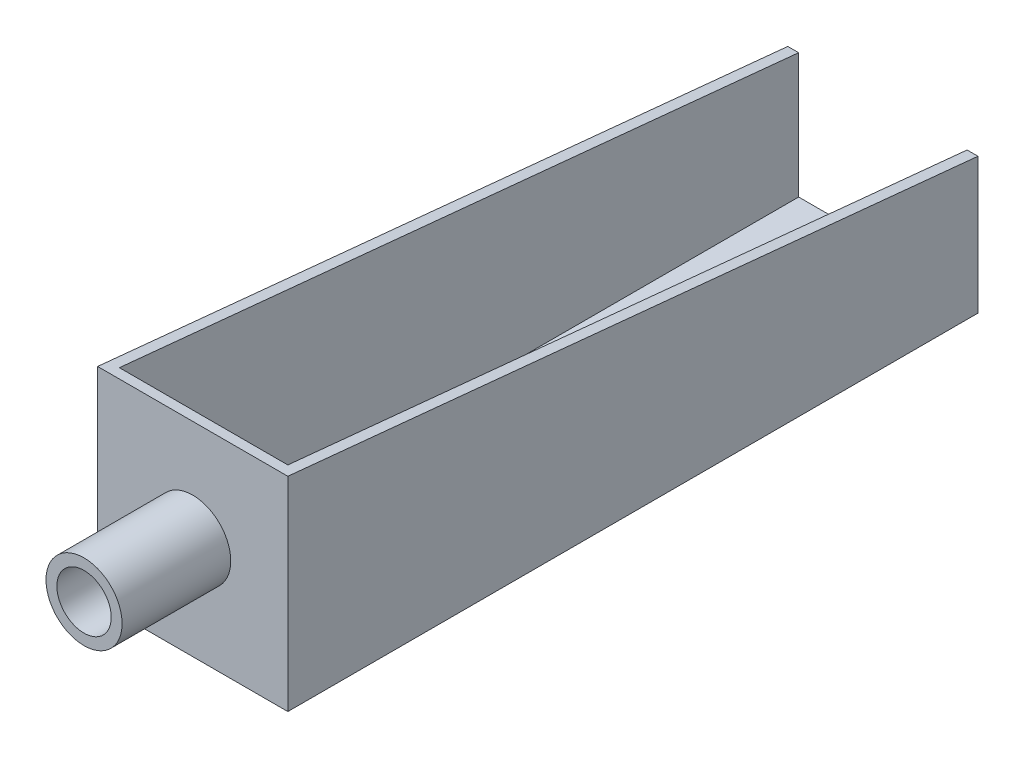
ISO-10303-21;
HEADER;
FILE_DESCRIPTION(('STEP AP214'),'2;1');
FILE_NAME('part.step','',(''),(''),'','','');
FILE_SCHEMA(('AUTOMOTIVE_DESIGN { 1 0 10303 214 1 1 1 1 }'));
ENDSEC;
DATA;
#1=APPLICATION_CONTEXT('core data for automotive mechanical design processes');
#2=APPLICATION_PROTOCOL_DEFINITION('international standard','automotive_design',2000,#1);
#3=PRODUCT_CONTEXT('',#1,'mechanical');
#4=PRODUCT('Part','Part','',(#3));
#5=PRODUCT_RELATED_PRODUCT_CATEGORY('part','',(#4));
#6=PRODUCT_DEFINITION_FORMATION('','',#4);
#7=PRODUCT_DEFINITION_CONTEXT('part definition',#1,'design');
#8=PRODUCT_DEFINITION('design','',#6,#7);
#9=PRODUCT_DEFINITION_SHAPE('','',#8);
#10=(LENGTH_UNIT() NAMED_UNIT(*) SI_UNIT(.MILLI.,.METRE.));
#11=(NAMED_UNIT(*) PLANE_ANGLE_UNIT() SI_UNIT($,.RADIAN.));
#12=(NAMED_UNIT(*) SI_UNIT($,.STERADIAN.) SOLID_ANGLE_UNIT());
#13=UNCERTAINTY_MEASURE_WITH_UNIT(LENGTH_MEASURE(1.E-05),#10,'distance_accuracy_value','');
#14=(GEOMETRIC_REPRESENTATION_CONTEXT(3) GLOBAL_UNCERTAINTY_ASSIGNED_CONTEXT((#13)) GLOBAL_UNIT_ASSIGNED_CONTEXT((#10,
#11,#12)) REPRESENTATION_CONTEXT('',''));
#15=CARTESIAN_POINT('',(0.,0.,0.));
#16=DIRECTION('',(0.,0.,1.));
#17=DIRECTION('',(1.,0.,0.));
#18=AXIS2_PLACEMENT_3D('',#15,#16,#17);
#19=CARTESIAN_POINT('',(35.,-37.5,4.));
#20=DIRECTION('',(-1.,0.,0.));
#21=DIRECTION('',(0.,0.,1.));
#22=AXIS2_PLACEMENT_3D('',#19,#20,#21);
#23=PLANE('',#22);
#24=DIRECTION('',(0.,-1.,0.));
#25=VECTOR('',#24,1.);
#26=CARTESIAN_POINT('',(35.,-37.5,-250.));
#27=LINE('',#26,#25);
#28=CARTESIAN_POINT('',(35.,12.5,-250.));
#29=VERTEX_POINT('',#28);
#30=CARTESIAN_POINT('',(35.,-37.5,-250.));
#31=VERTEX_POINT('',#30);
#32=EDGE_CURVE('E113',#29,#31,#27,.T.);
#33=ORIENTED_EDGE('',*,*,#32,.F.);
#34=DIRECTION('',(0.,0.0979518850000985,0.995191151601001));
#35=VECTOR('',#34,1.);
#36=CARTESIAN_POINT('',(35.,12.5,-250.));
#37=LINE('',#36,#35);
#38=CARTESIAN_POINT('',(35.,37.5,4.));
#39=VERTEX_POINT('',#38);
#40=EDGE_CURVE('E49',#29,#39,#37,.T.);
#41=ORIENTED_EDGE('',*,*,#40,.T.);
#42=DIRECTION('',(0.,1.,0.));
#43=VECTOR('',#42,1.);
#44=CARTESIAN_POINT('',(35.,-37.5,4.));
#45=LINE('',#44,#43);
#46=CARTESIAN_POINT('',(35.,-37.5,4.));
#47=VERTEX_POINT('',#46);
#48=EDGE_CURVE('E107',#47,#39,#45,.T.);
#49=ORIENTED_EDGE('',*,*,#48,.F.);
#50=DIRECTION('',(0.,0.,-1.));
#51=VECTOR('',#50,1.);
#52=CARTESIAN_POINT('',(35.,-37.5,4.));
#53=LINE('',#52,#51);
#54=EDGE_CURVE('E129',#47,#31,#53,.T.);
#55=ORIENTED_EDGE('',*,*,#54,.T.);
#56=EDGE_LOOP('',(#33,#41,#49,#55));
#57=FACE_BOUND('',#56,.T.);
#58=ADVANCED_FACE('F35',(#57),#23,.F.);
#59=CARTESIAN_POINT('',(-35.,-37.5,4.));
#60=DIRECTION('',(1.,0.,0.));
#61=DIRECTION('',(0.,0.,-1.));
#62=AXIS2_PLACEMENT_3D('',#59,#60,#61);
#63=PLANE('',#62);
#64=DIRECTION('',(0.,-1.,0.));
#65=VECTOR('',#64,1.);
#66=CARTESIAN_POINT('',(-35.,-37.5,4.));
#67=LINE('',#66,#65);
#68=CARTESIAN_POINT('',(-35.,37.5,4.));
#69=VERTEX_POINT('',#68);
#70=CARTESIAN_POINT('',(-35.,-37.5,4.));
#71=VERTEX_POINT('',#70);
#72=EDGE_CURVE('E106',#69,#71,#67,.T.);
#73=ORIENTED_EDGE('',*,*,#72,.F.);
#74=DIRECTION('',(0.,0.0979518850000985,0.995191151601001));
#75=VECTOR('',#74,1.);
#76=CARTESIAN_POINT('',(-35.,12.5,-250.));
#77=LINE('',#76,#75);
#78=CARTESIAN_POINT('',(-35.,12.5,-250.));
#79=VERTEX_POINT('',#78);
#80=EDGE_CURVE('E102',#79,#69,#77,.T.);
#81=ORIENTED_EDGE('',*,*,#80,.F.);
#82=DIRECTION('',(0.,1.,0.));
#83=VECTOR('',#82,1.);
#84=CARTESIAN_POINT('',(-35.,37.5,-250.));
#85=LINE('',#84,#83);
#86=CARTESIAN_POINT('',(-35.,-37.5,-250.));
#87=VERTEX_POINT('',#86);
#88=EDGE_CURVE('E141',#87,#79,#85,.T.);
#89=ORIENTED_EDGE('',*,*,#88,.F.);
#90=DIRECTION('',(0.,0.,-1.));
#91=VECTOR('',#90,1.);
#92=CARTESIAN_POINT('',(-35.,-37.5,4.));
#93=LINE('',#92,#91);
#94=EDGE_CURVE('E131',#71,#87,#93,.T.);
#95=ORIENTED_EDGE('',*,*,#94,.F.);
#96=EDGE_LOOP('',(#73,#81,#89,#95));
#97=FACE_BOUND('',#96,.T.);
#98=ADVANCED_FACE('F207',(#97),#63,.F.);
#99=CARTESIAN_POINT('',(-35.,-37.5,4.));
#100=DIRECTION('',(0.,1.,0.));
#101=DIRECTION('',(0.,0.,1.));
#102=AXIS2_PLACEMENT_3D('',#99,#100,#101);
#103=PLANE('',#102);
#104=ORIENTED_EDGE('',*,*,#94,.T.);
#105=DIRECTION('',(-1.,0.,0.));
#106=VECTOR('',#105,1.);
#107=CARTESIAN_POINT('',(-35.,-37.5,-250.));
#108=LINE('',#107,#106);
#109=EDGE_CURVE('E160',#31,#87,#108,.T.);
#110=ORIENTED_EDGE('',*,*,#109,.F.);
#111=ORIENTED_EDGE('',*,*,#54,.F.);
#112=DIRECTION('',(1.,0.,0.));
#113=VECTOR('',#112,1.);
#114=CARTESIAN_POINT('',(-35.,-37.5,4.));
#115=LINE('',#114,#113);
#116=EDGE_CURVE('E118',#71,#47,#115,.T.);
#117=ORIENTED_EDGE('',*,*,#116,.F.);
#118=EDGE_LOOP('',(#104,#110,#111,#117));
#119=FACE_BOUND('',#118,.T.);
#120=ADVANCED_FACE('F211',(#119),#103,.F.);
#121=CARTESIAN_POINT('',(0.,0.,4.));
#122=DIRECTION('',(0.,0.,-1.));
#123=DIRECTION('',(-1.,0.,0.));
#124=AXIS2_PLACEMENT_3D('',#121,#122,#123);
#125=PLANE('',#124);
#126=CARTESIAN_POINT('',(0.,0.,4.));
#127=DIRECTION('',(0.,0.,-1.));
#128=DIRECTION('',(-1.,0.,0.));
#129=AXIS2_PLACEMENT_3D('',#126,#127,#128);
#130=CIRCLE('',#129,14.);
#131=CARTESIAN_POINT('',(-14.,0.,4.));
#132=VERTEX_POINT('',#131);
#133=EDGE_CURVE('E11',#132,#132,#130,.F.);
#134=ORIENTED_EDGE('',*,*,#133,.F.);
#135=EDGE_LOOP('',(#134));
#136=FACE_BOUND('',#135,.T.);
#137=ORIENTED_EDGE('',*,*,#48,.T.);
#138=DIRECTION('',(-1.,0.,0.));
#139=VECTOR('',#138,1.);
#140=CARTESIAN_POINT('',(-35.,37.5,4.));
#141=LINE('',#140,#139);
#142=EDGE_CURVE('E99',#39,#69,#141,.T.);
#143=ORIENTED_EDGE('',*,*,#142,.T.);
#144=ORIENTED_EDGE('',*,*,#72,.T.);
#145=ORIENTED_EDGE('',*,*,#116,.T.);
#146=EDGE_LOOP('',(#137,#143,#144,#145));
#147=FACE_BOUND('',#146,.T.);
#148=ADVANCED_FACE('F116',(#136,#147),#125,.F.);
#149=CARTESIAN_POINT('',(0.,0.,0.));
#150=DIRECTION('',(0.,0.,-1.));
#151=DIRECTION('',(-1.,0.,0.));
#152=AXIS2_PLACEMENT_3D('',#149,#150,#151);
#153=PLANE('',#152);
#154=DIRECTION('',(-1.,0.,0.));
#155=VECTOR('',#154,1.);
#156=CARTESIAN_POINT('',(0.,37.1062992125984,0.));
#157=LINE('',#156,#155);
#158=CARTESIAN_POINT('',(31.,37.1062992125984,0.));
#159=VERTEX_POINT('',#158);
#160=CARTESIAN_POINT('',(-31.,37.1062992125984,0.));
#161=VERTEX_POINT('',#160);
#162=EDGE_CURVE('E174',#159,#161,#157,.T.);
#163=ORIENTED_EDGE('',*,*,#162,.F.);
#164=DIRECTION('',(0.,1.,0.));
#165=VECTOR('',#164,1.);
#166=CARTESIAN_POINT('',(31.,-33.5,0.));
#167=LINE('',#166,#165);
#168=CARTESIAN_POINT('',(31.,-33.5,0.));
#169=VERTEX_POINT('',#168);
#170=EDGE_CURVE('E57',#169,#159,#167,.T.);
#171=ORIENTED_EDGE('',*,*,#170,.F.);
#172=DIRECTION('',(1.,0.,0.));
#173=VECTOR('',#172,1.);
#174=CARTESIAN_POINT('',(-31.,-33.5,0.));
#175=LINE('',#174,#173);
#176=CARTESIAN_POINT('',(-31.,-33.5,0.));
#177=VERTEX_POINT('',#176);
#178=EDGE_CURVE('E152',#177,#169,#175,.T.);
#179=ORIENTED_EDGE('',*,*,#178,.F.);
#180=DIRECTION('',(0.,-1.,0.));
#181=VECTOR('',#180,1.);
#182=CARTESIAN_POINT('',(-31.,37.5,0.));
#183=LINE('',#182,#181);
#184=EDGE_CURVE('E163',#161,#177,#183,.T.);
#185=ORIENTED_EDGE('',*,*,#184,.F.);
#186=EDGE_LOOP('',(#163,#171,#179,#185));
#187=FACE_BOUND('',#186,.T.);
#188=ADVANCED_FACE('F173',(#187),#153,.T.);
#189=CARTESIAN_POINT('',(-31.,37.5,-250.));
#190=DIRECTION('',(-1.,0.,0.));
#191=DIRECTION('',(0.,0.,1.));
#192=AXIS2_PLACEMENT_3D('',#189,#190,#191);
#193=PLANE('',#192);
#194=DIRECTION('',(0.,-1.,0.));
#195=VECTOR('',#194,1.);
#196=CARTESIAN_POINT('',(-31.,37.5,-250.));
#197=LINE('',#196,#195);
#198=CARTESIAN_POINT('',(-31.,12.5,-250.));
#199=VERTEX_POINT('',#198);
#200=CARTESIAN_POINT('',(-31.,-33.5,-250.));
#201=VERTEX_POINT('',#200);
#202=EDGE_CURVE('E137',#199,#201,#197,.T.);
#203=ORIENTED_EDGE('',*,*,#202,.F.);
#204=DIRECTION('',(0.,0.0979518850000985,0.995191151601002));
#205=VECTOR('',#204,1.);
#206=CARTESIAN_POINT('',(-31.,12.7398642943768,-247.562978769132));
#207=LINE('',#206,#205);
#208=EDGE_CURVE('E145',#199,#161,#207,.T.);
#209=ORIENTED_EDGE('',*,*,#208,.T.);
#210=ORIENTED_EDGE('',*,*,#184,.T.);
#211=DIRECTION('',(0.,0.,1.));
#212=VECTOR('',#211,1.);
#213=CARTESIAN_POINT('',(-31.,-33.5,-250.));
#214=LINE('',#213,#212);
#215=EDGE_CURVE('E120',#201,#177,#214,.T.);
#216=ORIENTED_EDGE('',*,*,#215,.F.);
#217=EDGE_LOOP('',(#203,#209,#210,#216));
#218=FACE_BOUND('',#217,.T.);
#219=ADVANCED_FACE('F144',(#218),#193,.F.);
#220=CARTESIAN_POINT('',(-31.,-33.5,-250.));
#221=DIRECTION('',(0.,-1.,0.));
#222=DIRECTION('',(0.,0.,-1.));
#223=AXIS2_PLACEMENT_3D('',#220,#221,#222);
#224=PLANE('',#223);
#225=ORIENTED_EDGE('',*,*,#178,.T.);
#226=DIRECTION('',(0.,0.,1.));
#227=VECTOR('',#226,1.);
#228=CARTESIAN_POINT('',(31.,-33.5,-250.));
#229=LINE('',#228,#227);
#230=CARTESIAN_POINT('',(31.,-33.5,-250.));
#231=VERTEX_POINT('',#230);
#232=EDGE_CURVE('E123',#231,#169,#229,.T.);
#233=ORIENTED_EDGE('',*,*,#232,.F.);
#234=DIRECTION('',(1.,0.,0.));
#235=VECTOR('',#234,1.);
#236=CARTESIAN_POINT('',(-31.,-33.5,-250.));
#237=LINE('',#236,#235);
#238=EDGE_CURVE('E148',#201,#231,#237,.T.);
#239=ORIENTED_EDGE('',*,*,#238,.F.);
#240=ORIENTED_EDGE('',*,*,#215,.T.);
#241=EDGE_LOOP('',(#225,#233,#239,#240));
#242=FACE_BOUND('',#241,.T.);
#243=ADVANCED_FACE('F172',(#242),#224,.F.);
#244=CARTESIAN_POINT('',(31.,-33.5,-250.));
#245=DIRECTION('',(1.,0.,0.));
#246=DIRECTION('',(0.,0.,-1.));
#247=AXIS2_PLACEMENT_3D('',#244,#245,#246);
#248=PLANE('',#247);
#249=ORIENTED_EDGE('',*,*,#170,.T.);
#250=DIRECTION('',(0.,-0.0979518850000985,-0.995191151601002));
#251=VECTOR('',#250,1.);
#252=CARTESIAN_POINT('',(31.,12.0586496983467,-254.484119064798));
#253=LINE('',#252,#251);
#254=CARTESIAN_POINT('',(31.,12.5,-250.));
#255=VERTEX_POINT('',#254);
#256=EDGE_CURVE('E175',#159,#255,#253,.T.);
#257=ORIENTED_EDGE('',*,*,#256,.T.);
#258=DIRECTION('',(0.,1.,0.));
#259=VECTOR('',#258,1.);
#260=CARTESIAN_POINT('',(31.,-33.5,-250.));
#261=LINE('',#260,#259);
#262=EDGE_CURVE('E150',#231,#255,#261,.T.);
#263=ORIENTED_EDGE('',*,*,#262,.F.);
#264=ORIENTED_EDGE('',*,*,#232,.T.);
#265=EDGE_LOOP('',(#249,#257,#263,#264));
#266=FACE_BOUND('',#265,.T.);
#267=ADVANCED_FACE('F169',(#266),#248,.F.);
#268=CARTESIAN_POINT('',(0.,0.,-250.));
#269=DIRECTION('',(0.,0.,1.));
#270=DIRECTION('',(1.,0.,0.));
#271=AXIS2_PLACEMENT_3D('',#268,#269,#270);
#272=PLANE('',#271);
#273=ORIENTED_EDGE('',*,*,#88,.T.);
#274=DIRECTION('',(1.,0.,0.));
#275=VECTOR('',#274,1.);
#276=CARTESIAN_POINT('',(0.,12.5,-250.));
#277=LINE('',#276,#275);
#278=EDGE_CURVE('E42',#79,#199,#277,.T.);
#279=ORIENTED_EDGE('',*,*,#278,.T.);
#280=ORIENTED_EDGE('',*,*,#202,.T.);
#281=ORIENTED_EDGE('',*,*,#238,.T.);
#282=ORIENTED_EDGE('',*,*,#262,.T.);
#283=DIRECTION('',(-1.,0.,0.));
#284=VECTOR('',#283,1.);
#285=CARTESIAN_POINT('',(35.,12.5,-250.));
#286=LINE('',#285,#284);
#287=EDGE_CURVE('E114',#29,#255,#286,.T.);
#288=ORIENTED_EDGE('',*,*,#287,.F.);
#289=ORIENTED_EDGE('',*,*,#32,.T.);
#290=ORIENTED_EDGE('',*,*,#109,.T.);
#291=EDGE_LOOP('',(#273,#279,#280,#281,#282,#288,#289,#290));
#292=FACE_BOUND('',#291,.T.);
#293=ADVANCED_FACE('F136',(#292),#272,.F.);
#294=CARTESIAN_POINT('',(35.,12.5,-250.));
#295=DIRECTION('',(0.,-0.995191151601001,0.0979518850000985));
#296=DIRECTION('',(0.,-0.0979518850000985,-0.995191151601002));
#297=AXIS2_PLACEMENT_3D('',#294,#295,#296);
#298=PLANE('',#297);
#299=ORIENTED_EDGE('',*,*,#278,.F.);
#300=ORIENTED_EDGE('',*,*,#80,.T.);
#301=ORIENTED_EDGE('',*,*,#142,.F.);
#302=ORIENTED_EDGE('',*,*,#40,.F.);
#303=ORIENTED_EDGE('',*,*,#287,.T.);
#304=ORIENTED_EDGE('',*,*,#256,.F.);
#305=ORIENTED_EDGE('',*,*,#162,.T.);
#306=ORIENTED_EDGE('',*,*,#208,.F.);
#307=EDGE_LOOP('',(#299,#300,#301,#302,#303,#304,#305,#306));
#308=FACE_BOUND('',#307,.T.);
#309=ADVANCED_FACE('F100',(#308),#298,.F.);
#310=CARTESIAN_POINT('',(0.,0.,44.));
#311=DIRECTION('',(0.,0.,1.));
#312=DIRECTION('',(1.,0.,0.));
#313=AXIS2_PLACEMENT_3D('',#310,#311,#312);
#314=PLANE('',#313);
#315=CARTESIAN_POINT('',(0.,0.,44.));
#316=DIRECTION('',(0.,0.,1.));
#317=DIRECTION('',(1.,0.,0.));
#318=AXIS2_PLACEMENT_3D('',#315,#316,#317);
#319=CIRCLE('',#318,14.);
#320=CARTESIAN_POINT('',(14.,0.,44.));
#321=VERTEX_POINT('',#320);
#322=EDGE_CURVE('E179',#321,#321,#319,.T.);
#323=ORIENTED_EDGE('',*,*,#322,.T.);
#324=EDGE_LOOP('',(#323));
#325=FACE_BOUND('',#324,.T.);
#326=CARTESIAN_POINT('',(0.,0.,44.));
#327=DIRECTION('',(0.,0.,1.));
#328=DIRECTION('',(1.,0.,0.));
#329=AXIS2_PLACEMENT_3D('',#326,#327,#328);
#330=CIRCLE('',#329,10.);
#331=CARTESIAN_POINT('',(10.,0.,44.));
#332=VERTEX_POINT('',#331);
#333=EDGE_CURVE('E183',#332,#332,#330,.T.);
#334=ORIENTED_EDGE('',*,*,#333,.F.);
#335=EDGE_LOOP('',(#334));
#336=FACE_BOUND('',#335,.T.);
#337=ADVANCED_FACE('F193',(#325,#336),#314,.T.);
#338=CARTESIAN_POINT('',(0.,0.,44.));
#339=DIRECTION('',(0.,0.,-1.));
#340=DIRECTION('',(-1.,0.,0.));
#341=AXIS2_PLACEMENT_3D('',#338,#339,#340);
#342=CYLINDRICAL_SURFACE('',#341,14.);
#343=ORIENTED_EDGE('',*,*,#322,.F.);
#344=EDGE_LOOP('',(#343));
#345=FACE_BOUND('',#344,.T.);
#346=ORIENTED_EDGE('',*,*,#133,.T.);
#347=EDGE_LOOP('',(#346));
#348=FACE_BOUND('',#347,.T.);
#349=ADVANCED_FACE('F195',(#345,#348),#342,.T.);
#350=CARTESIAN_POINT('',(0.,0.,44.));
#351=DIRECTION('',(0.,0.,-1.));
#352=DIRECTION('',(-1.,0.,0.));
#353=AXIS2_PLACEMENT_3D('',#350,#351,#352);
#354=CYLINDRICAL_SURFACE('',#353,10.);
#355=ORIENTED_EDGE('',*,*,#333,.T.);
#356=EDGE_LOOP('',(#355));
#357=FACE_BOUND('',#356,.T.);
#358=CARTESIAN_POINT('',(0.,0.,4.));
#359=DIRECTION('',(0.,0.,1.));
#360=DIRECTION('',(1.,0.,0.));
#361=AXIS2_PLACEMENT_3D('',#358,#359,#360);
#362=CIRCLE('',#361,10.);
#363=CARTESIAN_POINT('',(10.,0.,4.));
#364=VERTEX_POINT('',#363);
#365=EDGE_CURVE('E184',#364,#364,#362,.T.);
#366=ORIENTED_EDGE('',*,*,#365,.F.);
#367=EDGE_LOOP('',(#366));
#368=FACE_BOUND('',#367,.T.);
#369=ADVANCED_FACE('F190',(#357,#368),#354,.F.);
#370=ORIENTED_EDGE('',*,*,#365,.T.);
#371=EDGE_LOOP('',(#370));
#372=FACE_BOUND('',#371,.T.);
#373=ADVANCED_FACE('F224',(#372),#125,.F.);
#374=CLOSED_SHELL('',(#58,#98,#120,#148,#188,#219,#243,#267,#293,#309,#337,#349,#369,#373));
#375=MANIFOLD_SOLID_BREP('B2',#374);
#376=ADVANCED_BREP_SHAPE_REPRESENTATION('',(#18,#375),#14);
#377=SHAPE_DEFINITION_REPRESENTATION(#9,#376);
ENDSEC;
END-ISO-10303-21;
